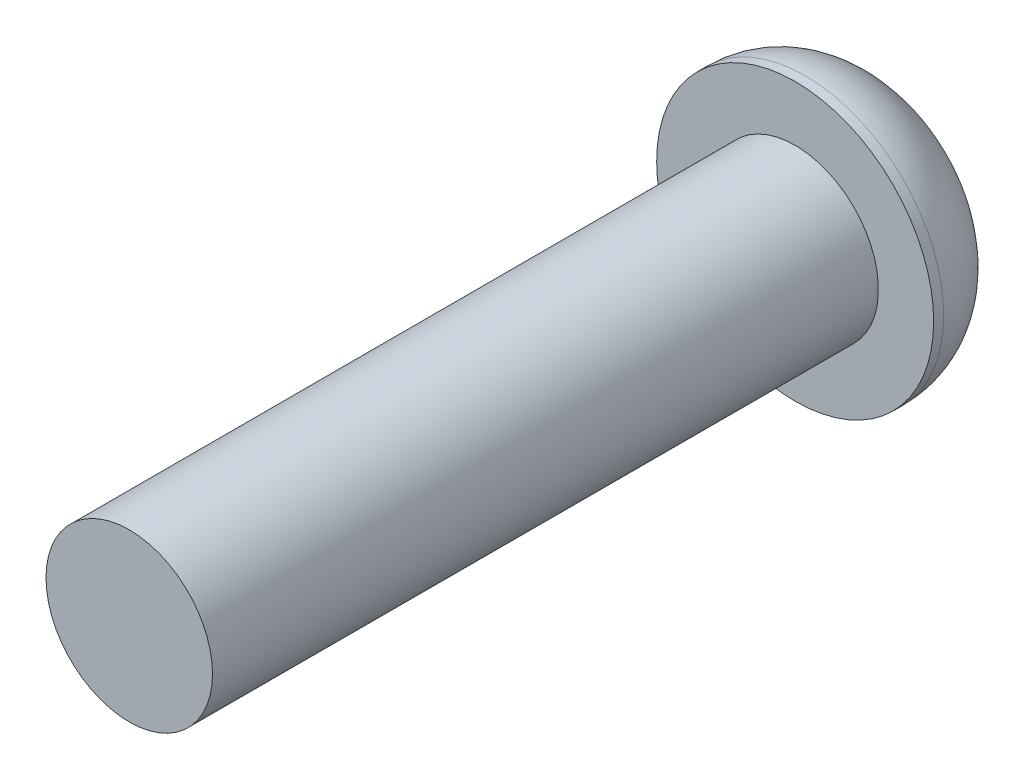
ISO-10303-21;
HEADER;
FILE_DESCRIPTION(('STEP AP214'),'2;1');
FILE_NAME('part.step','',(''),(''),'','','');
FILE_SCHEMA(('AUTOMOTIVE_DESIGN { 1 0 10303 214 1 1 1 1 }'));
ENDSEC;
DATA;
#1=APPLICATION_CONTEXT('core data for automotive mechanical design processes');
#2=APPLICATION_PROTOCOL_DEFINITION('international standard','automotive_design',2000,#1);
#3=PRODUCT_CONTEXT('',#1,'mechanical');
#4=PRODUCT('Part','Part','',(#3));
#5=PRODUCT_RELATED_PRODUCT_CATEGORY('part','',(#4));
#6=PRODUCT_DEFINITION_FORMATION('','',#4);
#7=PRODUCT_DEFINITION_CONTEXT('part definition',#1,'design');
#8=PRODUCT_DEFINITION('design','',#6,#7);
#9=PRODUCT_DEFINITION_SHAPE('','',#8);
#10=(LENGTH_UNIT() NAMED_UNIT(*) SI_UNIT(.MILLI.,.METRE.));
#11=(NAMED_UNIT(*) PLANE_ANGLE_UNIT() SI_UNIT($,.RADIAN.));
#12=(NAMED_UNIT(*) SI_UNIT($,.STERADIAN.) SOLID_ANGLE_UNIT());
#13=UNCERTAINTY_MEASURE_WITH_UNIT(LENGTH_MEASURE(1.E-05),#10,'distance_accuracy_value','');
#14=(GEOMETRIC_REPRESENTATION_CONTEXT(3) GLOBAL_UNCERTAINTY_ASSIGNED_CONTEXT((#13)) GLOBAL_UNIT_ASSIGNED_CONTEXT((#10,
#11,#12)) REPRESENTATION_CONTEXT('',''));
#15=CARTESIAN_POINT('',(0.,0.,0.));
#16=DIRECTION('',(0.,0.,1.));
#17=DIRECTION('',(1.,0.,0.));
#18=AXIS2_PLACEMENT_3D('',#15,#16,#17);
#19=CARTESIAN_POINT('',(0.,0.,20.));
#20=DIRECTION('',(0.,0.,-1.));
#21=DIRECTION('',(-1.,0.,0.));
#22=AXIS2_PLACEMENT_3D('',#19,#20,#21);
#23=CYLINDRICAL_SURFACE('',#22,2.5);
#24=CARTESIAN_POINT('',(0.,0.,20.));
#25=DIRECTION('',(0.,0.,1.));
#26=DIRECTION('',(1.,0.,0.));
#27=AXIS2_PLACEMENT_3D('',#24,#25,#26);
#28=CIRCLE('',#27,2.5);
#29=CARTESIAN_POINT('',(2.5,0.,20.));
#30=VERTEX_POINT('',#29);
#31=EDGE_CURVE('E146',#30,#30,#28,.T.);
#32=ORIENTED_EDGE('',*,*,#31,.F.);
#33=EDGE_LOOP('',(#32));
#34=FACE_BOUND('',#33,.T.);
#35=CARTESIAN_POINT('',(0.,0.,0.));
#36=DIRECTION('',(0.,0.,-1.));
#37=DIRECTION('',(-1.,0.,0.));
#38=AXIS2_PLACEMENT_3D('',#35,#36,#37);
#39=CIRCLE('',#38,2.5);
#40=CARTESIAN_POINT('',(-2.5,0.,0.));
#41=VERTEX_POINT('',#40);
#42=EDGE_CURVE('E143',#41,#41,#39,.T.);
#43=ORIENTED_EDGE('',*,*,#42,.F.);
#44=EDGE_LOOP('',(#43));
#45=FACE_BOUND('',#44,.T.);
#46=ADVANCED_FACE('F33',(#34,#45),#23,.T.);
#47=CARTESIAN_POINT('',(0.,0.,20.));
#48=DIRECTION('',(0.,0.,1.));
#49=DIRECTION('',(1.,0.,0.));
#50=AXIS2_PLACEMENT_3D('',#47,#48,#49);
#51=PLANE('',#50);
#52=ORIENTED_EDGE('',*,*,#31,.T.);
#53=EDGE_LOOP('',(#52));
#54=FACE_BOUND('',#53,.T.);
#55=ADVANCED_FACE('F167',(#54),#51,.T.);
#56=CARTESIAN_POINT('',(0.,0.,0.));
#57=DIRECTION('',(0.,0.,-1.));
#58=DIRECTION('',(-1.,0.,0.));
#59=AXIS2_PLACEMENT_3D('',#56,#57,#58);
#60=PLANE('',#59);
#61=CARTESIAN_POINT('',(0.,0.,0.));
#62=DIRECTION('',(0.,0.,-1.));
#63=DIRECTION('',(-1.,0.,0.));
#64=AXIS2_PLACEMENT_3D('',#61,#62,#63);
#65=CIRCLE('',#64,4.15958487677486);
#66=CARTESIAN_POINT('',(-4.15958487677486,0.,0.));
#67=VERTEX_POINT('',#66);
#68=EDGE_CURVE('E135',#67,#67,#65,.T.);
#69=ORIENTED_EDGE('',*,*,#68,.F.);
#70=EDGE_LOOP('',(#69));
#71=FACE_BOUND('',#70,.T.);
#72=ORIENTED_EDGE('',*,*,#42,.T.);
#73=EDGE_LOOP('',(#72));
#74=FACE_BOUND('',#73,.T.);
#75=ADVANCED_FACE('F172',(#71,#74),#60,.F.);
#76=CARTESIAN_POINT('',(0.,0.,-2.8));
#77=DIRECTION('',(0.,0.,1.));
#78=DIRECTION('',(1.,0.,0.));
#79=AXIS2_PLACEMENT_3D('',#76,#77,#78);
#80=CYLINDRICAL_SURFACE('',#79,4.15958487677486);
#81=CARTESIAN_POINT('',(0.,0.,-0.3));
#82=DIRECTION('',(0.,0.,-1.));
#83=DIRECTION('',(-1.,0.,0.));
#84=AXIS2_PLACEMENT_3D('',#81,#82,#83);
#85=CIRCLE('',#84,4.15958487677486);
#86=CARTESIAN_POINT('',(-4.15958487677486,0.,-0.3));
#87=VERTEX_POINT('',#86);
#88=EDGE_CURVE('E11',#87,#87,#85,.F.);
#89=ORIENTED_EDGE('',*,*,#88,.T.);
#90=EDGE_LOOP('',(#89));
#91=FACE_BOUND('',#90,.T.);
#92=ORIENTED_EDGE('',*,*,#68,.T.);
#93=EDGE_LOOP('',(#92));
#94=FACE_BOUND('',#93,.T.);
#95=ADVANCED_FACE('F162',(#91,#94),#80,.T.);
#96=CARTESIAN_POINT('',(0.,0.,-2.8));
#97=DIRECTION('',(0.,0.,-1.));
#98=DIRECTION('',(-1.,0.,0.));
#99=AXIS2_PLACEMENT_3D('',#96,#97,#98);
#100=PLANE('',#99);
#101=DIRECTION('',(-0.814788791019046,0.579757902947188,0.));
#102=VECTOR('',#101,1.);
#103=CARTESIAN_POINT('',(-0.144973678126217,-1.52414450415627,-2.8));
#104=LINE('',#103,#102);
#105=CARTESIAN_POINT('',(-0.144973678126217,-1.52414450415627,-2.8));
#106=VERTEX_POINT('',#105);
#107=CARTESIAN_POINT('',(-1.39243469870088,-0.636521363940765,-2.8));
#108=VERTEX_POINT('',#107);
#109=EDGE_CURVE('E48',#106,#108,#104,.T.);
#110=ORIENTED_EDGE('',*,*,#109,.F.);
#111=DIRECTION('',(-0.909479467506581,-0.415748840267711,0.));
#112=VECTOR('',#111,1.);
#113=CARTESIAN_POINT('',(1.24746102057466,-0.887623140215509,-2.8));
#114=LINE('',#113,#112);
#115=CARTESIAN_POINT('',(1.24746102057466,-0.887623140215509,-2.8));
#116=VERTEX_POINT('',#115);
#117=EDGE_CURVE('E131',#116,#106,#114,.T.);
#118=ORIENTED_EDGE('',*,*,#117,.F.);
#119=DIRECTION('',(-0.0946906764875342,-0.995506743214898,0.));
#120=VECTOR('',#119,1.);
#121=CARTESIAN_POINT('',(1.39243469870088,0.636521363940765,-2.8));
#122=LINE('',#121,#120);
#123=CARTESIAN_POINT('',(1.39243469870088,0.636521363940765,-2.8));
#124=VERTEX_POINT('',#123);
#125=EDGE_CURVE('E129',#124,#116,#122,.T.);
#126=ORIENTED_EDGE('',*,*,#125,.F.);
#127=DIRECTION('',(0.814788791019046,-0.579757902947188,0.));
#128=VECTOR('',#127,1.);
#129=CARTESIAN_POINT('',(0.144973678126217,1.52414450415627,-2.8));
#130=LINE('',#129,#128);
#131=CARTESIAN_POINT('',(0.144973678126217,1.52414450415627,-2.8));
#132=VERTEX_POINT('',#131);
#133=EDGE_CURVE('E96',#132,#124,#130,.T.);
#134=ORIENTED_EDGE('',*,*,#133,.F.);
#135=DIRECTION('',(0.909479467506581,0.41574884026771,0.));
#136=VECTOR('',#135,1.);
#137=CARTESIAN_POINT('',(-1.24746102057466,0.88762314021551,-2.8));
#138=LINE('',#137,#136);
#139=CARTESIAN_POINT('',(-1.24746102057466,0.88762314021551,-2.8));
#140=VERTEX_POINT('',#139);
#141=EDGE_CURVE('E125',#140,#132,#138,.T.);
#142=ORIENTED_EDGE('',*,*,#141,.F.);
#143=DIRECTION('',(0.0946906764875343,0.995506743214898,0.));
#144=VECTOR('',#143,1.);
#145=CARTESIAN_POINT('',(-1.39243469870088,-0.636521363940765,-2.8));
#146=LINE('',#145,#144);
#147=EDGE_CURVE('E122',#108,#140,#146,.T.);
#148=ORIENTED_EDGE('',*,*,#147,.F.);
#149=EDGE_LOOP('',(#110,#118,#126,#134,#142,#148));
#150=FACE_BOUND('',#149,.T.);
#151=CARTESIAN_POINT('',(0.,0.,-2.8));
#152=DIRECTION('',(0.,0.,-1.));
#153=DIRECTION('',(-1.,0.,0.));
#154=AXIS2_PLACEMENT_3D('',#151,#152,#153);
#155=CIRCLE('',#154,1.65958487677486);
#156=CARTESIAN_POINT('',(-1.65958487677486,0.,-2.8));
#157=VERTEX_POINT('',#156);
#158=EDGE_CURVE('E41',#157,#157,#155,.T.);
#159=ORIENTED_EDGE('',*,*,#158,.T.);
#160=EDGE_LOOP('',(#159));
#161=FACE_BOUND('',#160,.T.);
#162=ADVANCED_FACE('F151',(#150,#161),#100,.T.);
#163=CARTESIAN_POINT('',(0.,0.,-0.3));
#164=DIRECTION('',(0.,0.,-1.));
#165=DIRECTION('',(-1.,0.,0.));
#166=AXIS2_PLACEMENT_3D('',#163,#164,#165);
#167=DEGENERATE_TOROIDAL_SURFACE('',#166,1.65958487677486,2.5,.T.);
#168=ORIENTED_EDGE('',*,*,#88,.F.);
#169=EDGE_LOOP('',(#168));
#170=FACE_BOUND('',#169,.T.);
#171=ORIENTED_EDGE('',*,*,#158,.F.);
#172=EDGE_LOOP('',(#171));
#173=FACE_BOUND('',#172,.T.);
#174=ADVANCED_FACE('F35',(#170,#173),#167,.T.);
#175=CARTESIAN_POINT('',(-0.144973678126217,-1.52414450415627,-0.8));
#176=DIRECTION('',(-0.579757902947188,-0.814788791019046,0.));
#177=DIRECTION('',(0.814788791019046,-0.579757902947188,0.));
#178=AXIS2_PLACEMENT_3D('',#175,#176,#177);
#179=PLANE('',#178);
#180=ORIENTED_EDGE('',*,*,#109,.T.);
#181=DIRECTION('',(0.,0.,-1.));
#182=VECTOR('',#181,1.);
#183=CARTESIAN_POINT('',(-1.39243469870088,-0.636521363940765,-0.8));
#184=LINE('',#183,#182);
#185=CARTESIAN_POINT('',(-1.39243469870088,-0.636521363940765,-0.8));
#186=VERTEX_POINT('',#185);
#187=EDGE_CURVE('E78',#186,#108,#184,.T.);
#188=ORIENTED_EDGE('',*,*,#187,.F.);
#189=DIRECTION('',(-0.814788791019046,0.579757902947188,0.));
#190=VECTOR('',#189,1.);
#191=CARTESIAN_POINT('',(-0.144973678126217,-1.52414450415627,-0.8));
#192=LINE('',#191,#190);
#193=CARTESIAN_POINT('',(-0.144973678126217,-1.52414450415627,-0.8));
#194=VERTEX_POINT('',#193);
#195=EDGE_CURVE('E133',#194,#186,#192,.T.);
#196=ORIENTED_EDGE('',*,*,#195,.F.);
#197=DIRECTION('',(0.,0.,-1.));
#198=VECTOR('',#197,1.);
#199=CARTESIAN_POINT('',(-0.144973678126217,-1.52414450415627,-0.8));
#200=LINE('',#199,#198);
#201=EDGE_CURVE('E56',#194,#106,#200,.T.);
#202=ORIENTED_EDGE('',*,*,#201,.T.);
#203=EDGE_LOOP('',(#180,#188,#196,#202));
#204=FACE_BOUND('',#203,.T.);
#205=ADVANCED_FACE('F154',(#204),#179,.F.);
#206=CARTESIAN_POINT('',(1.24746102057466,-0.887623140215509,-0.8));
#207=DIRECTION('',(0.415748840267711,-0.909479467506581,0.));
#208=DIRECTION('',(0.909479467506581,0.415748840267711,0.));
#209=AXIS2_PLACEMENT_3D('',#206,#207,#208);
#210=PLANE('',#209);
#211=ORIENTED_EDGE('',*,*,#117,.T.);
#212=ORIENTED_EDGE('',*,*,#201,.F.);
#213=DIRECTION('',(-0.909479467506581,-0.415748840267711,0.));
#214=VECTOR('',#213,1.);
#215=CARTESIAN_POINT('',(1.24746102057466,-0.887623140215509,-0.8));
#216=LINE('',#215,#214);
#217=CARTESIAN_POINT('',(1.24746102057466,-0.887623140215509,-0.8));
#218=VERTEX_POINT('',#217);
#219=EDGE_CURVE('E108',#218,#194,#216,.T.);
#220=ORIENTED_EDGE('',*,*,#219,.F.);
#221=DIRECTION('',(0.,0.,-1.));
#222=VECTOR('',#221,1.);
#223=CARTESIAN_POINT('',(1.24746102057466,-0.887623140215509,-0.8));
#224=LINE('',#223,#222);
#225=EDGE_CURVE('E100',#218,#116,#224,.T.);
#226=ORIENTED_EDGE('',*,*,#225,.T.);
#227=EDGE_LOOP('',(#211,#212,#220,#226));
#228=FACE_BOUND('',#227,.T.);
#229=ADVANCED_FACE('F160',(#228),#210,.F.);
#230=CARTESIAN_POINT('',(1.39243469870088,0.636521363940765,-0.8));
#231=DIRECTION('',(0.995506743214898,-0.0946906764875343,0.));
#232=DIRECTION('',(0.0946906764875343,0.995506743214898,0.));
#233=AXIS2_PLACEMENT_3D('',#230,#231,#232);
#234=PLANE('',#233);
#235=ORIENTED_EDGE('',*,*,#125,.T.);
#236=ORIENTED_EDGE('',*,*,#225,.F.);
#237=DIRECTION('',(-0.0946906764875342,-0.995506743214898,0.));
#238=VECTOR('',#237,1.);
#239=CARTESIAN_POINT('',(1.39243469870088,0.636521363940765,-0.8));
#240=LINE('',#239,#238);
#241=CARTESIAN_POINT('',(1.39243469870088,0.636521363940765,-0.8));
#242=VERTEX_POINT('',#241);
#243=EDGE_CURVE('E104',#242,#218,#240,.T.);
#244=ORIENTED_EDGE('',*,*,#243,.F.);
#245=DIRECTION('',(0.,0.,-1.));
#246=VECTOR('',#245,1.);
#247=CARTESIAN_POINT('',(1.39243469870088,0.636521363940765,-0.8));
#248=LINE('',#247,#246);
#249=EDGE_CURVE('E89',#242,#124,#248,.T.);
#250=ORIENTED_EDGE('',*,*,#249,.T.);
#251=EDGE_LOOP('',(#235,#236,#244,#250));
#252=FACE_BOUND('',#251,.T.);
#253=ADVANCED_FACE('F105',(#252),#234,.F.);
#254=CARTESIAN_POINT('',(0.144973678126217,1.52414450415627,-0.8));
#255=DIRECTION('',(0.579757902947188,0.814788791019046,0.));
#256=DIRECTION('',(-0.814788791019047,0.579757902947188,0.));
#257=AXIS2_PLACEMENT_3D('',#254,#255,#256);
#258=PLANE('',#257);
#259=ORIENTED_EDGE('',*,*,#133,.T.);
#260=ORIENTED_EDGE('',*,*,#249,.F.);
#261=DIRECTION('',(0.814788791019046,-0.579757902947188,0.));
#262=VECTOR('',#261,1.);
#263=CARTESIAN_POINT('',(0.144973678126217,1.52414450415627,-0.8));
#264=LINE('',#263,#262);
#265=CARTESIAN_POINT('',(0.144973678126217,1.52414450415627,-0.8));
#266=VERTEX_POINT('',#265);
#267=EDGE_CURVE('E93',#266,#242,#264,.T.);
#268=ORIENTED_EDGE('',*,*,#267,.F.);
#269=DIRECTION('',(0.,0.,-1.));
#270=VECTOR('',#269,1.);
#271=CARTESIAN_POINT('',(0.144973678126217,1.52414450415627,-0.8));
#272=LINE('',#271,#270);
#273=EDGE_CURVE('E101',#266,#132,#272,.T.);
#274=ORIENTED_EDGE('',*,*,#273,.T.);
#275=EDGE_LOOP('',(#259,#260,#268,#274));
#276=FACE_BOUND('',#275,.T.);
#277=ADVANCED_FACE('F91',(#276),#258,.F.);
#278=CARTESIAN_POINT('',(-1.24746102057466,0.88762314021551,-0.8));
#279=DIRECTION('',(-0.41574884026771,0.909479467506581,0.));
#280=DIRECTION('',(-0.909479467506581,-0.41574884026771,0.));
#281=AXIS2_PLACEMENT_3D('',#278,#279,#280);
#282=PLANE('',#281);
#283=ORIENTED_EDGE('',*,*,#141,.T.);
#284=ORIENTED_EDGE('',*,*,#273,.F.);
#285=DIRECTION('',(0.909479467506581,0.41574884026771,0.));
#286=VECTOR('',#285,1.);
#287=CARTESIAN_POINT('',(-1.24746102057466,0.88762314021551,-0.8));
#288=LINE('',#287,#286);
#289=CARTESIAN_POINT('',(-1.24746102057466,0.88762314021551,-0.8));
#290=VERTEX_POINT('',#289);
#291=EDGE_CURVE('E114',#290,#266,#288,.T.);
#292=ORIENTED_EDGE('',*,*,#291,.F.);
#293=DIRECTION('',(0.,0.,-1.));
#294=VECTOR('',#293,1.);
#295=CARTESIAN_POINT('',(-1.24746102057466,0.88762314021551,-0.8));
#296=LINE('',#295,#294);
#297=EDGE_CURVE('E138',#290,#140,#296,.T.);
#298=ORIENTED_EDGE('',*,*,#297,.T.);
#299=EDGE_LOOP('',(#283,#284,#292,#298));
#300=FACE_BOUND('',#299,.T.);
#301=ADVANCED_FACE('F187',(#300),#282,.F.);
#302=CARTESIAN_POINT('',(-1.39243469870088,-0.636521363940765,-0.8));
#303=DIRECTION('',(-0.995506743214898,0.0946906764875343,0.));
#304=DIRECTION('',(-0.0946906764875343,-0.995506743214898,0.));
#305=AXIS2_PLACEMENT_3D('',#302,#303,#304);
#306=PLANE('',#305);
#307=ORIENTED_EDGE('',*,*,#147,.T.);
#308=ORIENTED_EDGE('',*,*,#297,.F.);
#309=DIRECTION('',(0.0946906764875343,0.995506743214898,0.));
#310=VECTOR('',#309,1.);
#311=CARTESIAN_POINT('',(-1.39243469870088,-0.636521363940765,-0.8));
#312=LINE('',#311,#310);
#313=EDGE_CURVE('E116',#186,#290,#312,.T.);
#314=ORIENTED_EDGE('',*,*,#313,.F.);
#315=ORIENTED_EDGE('',*,*,#187,.T.);
#316=EDGE_LOOP('',(#307,#308,#314,#315));
#317=FACE_BOUND('',#316,.T.);
#318=ADVANCED_FACE('F184',(#317),#306,.F.);
#319=CARTESIAN_POINT('',(0.,0.,-0.8));
#320=DIRECTION('',(0.,0.,-1.));
#321=DIRECTION('',(-1.,0.,0.));
#322=AXIS2_PLACEMENT_3D('',#319,#320,#321);
#323=PLANE('',#322);
#324=ORIENTED_EDGE('',*,*,#195,.T.);
#325=ORIENTED_EDGE('',*,*,#313,.T.);
#326=ORIENTED_EDGE('',*,*,#291,.T.);
#327=ORIENTED_EDGE('',*,*,#267,.T.);
#328=ORIENTED_EDGE('',*,*,#243,.T.);
#329=ORIENTED_EDGE('',*,*,#219,.T.);
#330=EDGE_LOOP('',(#324,#325,#326,#327,#328,#329));
#331=FACE_BOUND('',#330,.T.);
#332=ADVANCED_FACE('F111',(#331),#323,.T.);
#333=CLOSED_SHELL('',(#46,#55,#75,#95,#162,#174,#205,#229,#253,#277,#301,#318,#332));
#334=MANIFOLD_SOLID_BREP('B2',#333);
#335=ADVANCED_BREP_SHAPE_REPRESENTATION('',(#18,#334),#14);
#336=SHAPE_DEFINITION_REPRESENTATION(#9,#335);
ENDSEC;
END-ISO-10303-21;
